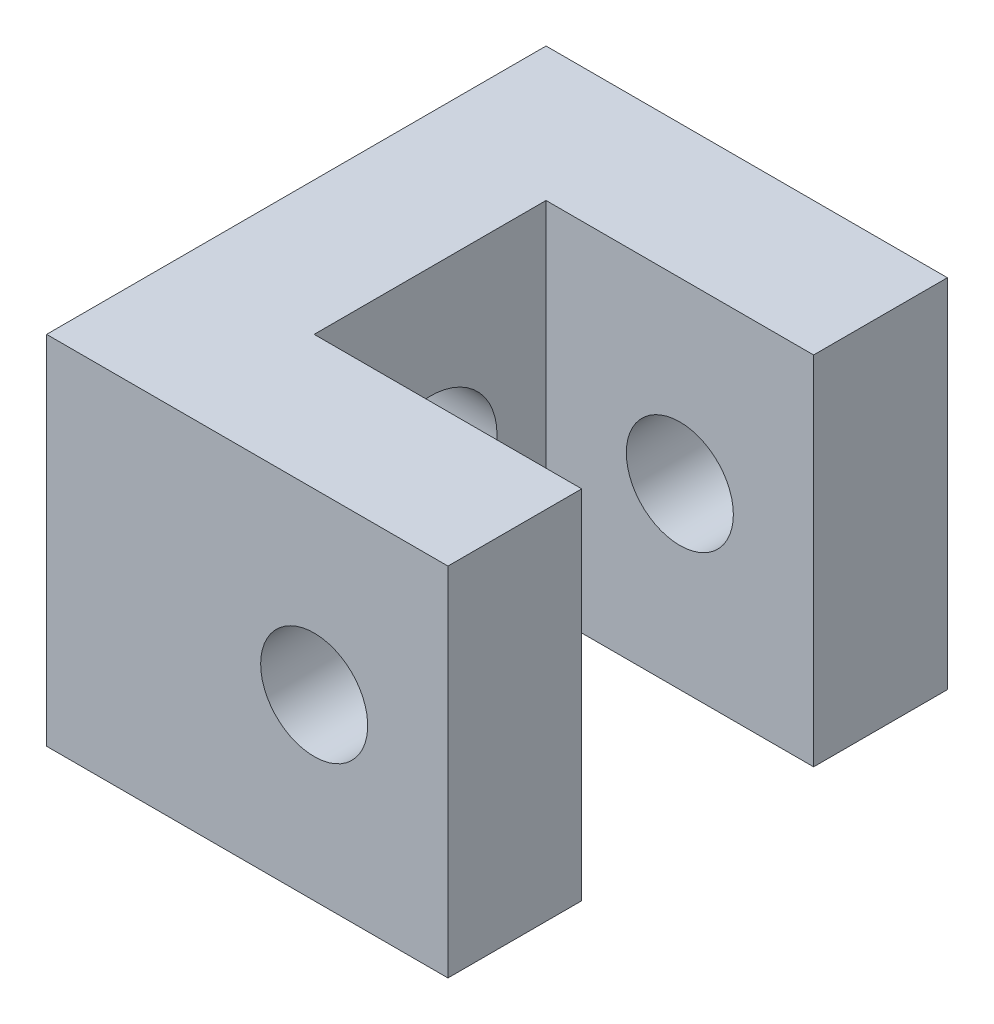
ISO-10303-21;
HEADER;
FILE_DESCRIPTION(('STEP AP214'),'2;1');
FILE_NAME('part.step','',(''),(''),'','','');
FILE_SCHEMA(('AUTOMOTIVE_DESIGN { 1 0 10303 214 1 1 1 1 }'));
ENDSEC;
DATA;
#1=APPLICATION_CONTEXT('core data for automotive mechanical design processes');
#2=APPLICATION_PROTOCOL_DEFINITION('international standard','automotive_design',2000,#1);
#3=PRODUCT_CONTEXT('',#1,'mechanical');
#4=PRODUCT('Part','Part','',(#3));
#5=PRODUCT_RELATED_PRODUCT_CATEGORY('part','',(#4));
#6=PRODUCT_DEFINITION_FORMATION('','',#4);
#7=PRODUCT_DEFINITION_CONTEXT('part definition',#1,'design');
#8=PRODUCT_DEFINITION('design','',#6,#7);
#9=PRODUCT_DEFINITION_SHAPE('','',#8);
#10=(LENGTH_UNIT() NAMED_UNIT(*) SI_UNIT(.MILLI.,.METRE.));
#11=(NAMED_UNIT(*) PLANE_ANGLE_UNIT() SI_UNIT($,.RADIAN.));
#12=(NAMED_UNIT(*) SI_UNIT($,.STERADIAN.) SOLID_ANGLE_UNIT());
#13=UNCERTAINTY_MEASURE_WITH_UNIT(LENGTH_MEASURE(1.E-05),#10,'distance_accuracy_value','');
#14=(GEOMETRIC_REPRESENTATION_CONTEXT(3) GLOBAL_UNCERTAINTY_ASSIGNED_CONTEXT((#13)) GLOBAL_UNIT_ASSIGNED_CONTEXT((#10,
#11,#12)) REPRESENTATION_CONTEXT('',''));
#15=CARTESIAN_POINT('',(0.,0.,0.));
#16=DIRECTION('',(0.,0.,1.));
#17=DIRECTION('',(1.,0.,0.));
#18=AXIS2_PLACEMENT_3D('',#15,#16,#17);
#19=CARTESIAN_POINT('',(-15.,-20.,0.));
#20=DIRECTION('',(0.,-1.,0.));
#21=DIRECTION('',(0.,0.,-1.));
#22=AXIS2_PLACEMENT_3D('',#19,#20,#21);
#23=PLANE('',#22);
#24=DIRECTION('',(0.,0.,-1.));
#25=VECTOR('',#24,1.);
#26=CARTESIAN_POINT('',(0.,-20.,0.));
#27=LINE('',#26,#25);
#28=CARTESIAN_POINT('',(0.,-20.,13.));
#29=VERTEX_POINT('',#28);
#30=CARTESIAN_POINT('',(0.,-20.,-13.));
#31=VERTEX_POINT('',#30);
#32=EDGE_CURVE('E158',#29,#31,#27,.T.);
#33=ORIENTED_EDGE('',*,*,#32,.F.);
#34=DIRECTION('',(-1.,0.,0.));
#35=VECTOR('',#34,1.);
#36=CARTESIAN_POINT('',(30.,-20.,13.));
#37=LINE('',#36,#35);
#38=CARTESIAN_POINT('',(30.,-20.,13.));
#39=VERTEX_POINT('',#38);
#40=EDGE_CURVE('E156',#39,#29,#37,.T.);
#41=ORIENTED_EDGE('',*,*,#40,.F.);
#42=DIRECTION('',(0.,0.,-1.));
#43=VECTOR('',#42,1.);
#44=CARTESIAN_POINT('',(30.,-20.,0.));
#45=LINE('',#44,#43);
#46=CARTESIAN_POINT('',(30.,-20.,28.));
#47=VERTEX_POINT('',#46);
#48=EDGE_CURVE('E135',#47,#39,#45,.T.);
#49=ORIENTED_EDGE('',*,*,#48,.F.);
#50=DIRECTION('',(1.,0.,0.));
#51=VECTOR('',#50,1.);
#52=CARTESIAN_POINT('',(-15.,-20.,28.));
#53=LINE('',#52,#51);
#54=CARTESIAN_POINT('',(-15.,-20.,28.));
#55=VERTEX_POINT('',#54);
#56=EDGE_CURVE('E11',#55,#47,#53,.T.);
#57=ORIENTED_EDGE('',*,*,#56,.F.);
#58=DIRECTION('',(0.,0.,-1.));
#59=VECTOR('',#58,1.);
#60=CARTESIAN_POINT('',(-15.,-20.,0.));
#61=LINE('',#60,#59);
#62=CARTESIAN_POINT('',(-15.,-20.,-28.));
#63=VERTEX_POINT('',#62);
#64=EDGE_CURVE('E149',#55,#63,#61,.T.);
#65=ORIENTED_EDGE('',*,*,#64,.T.);
#66=DIRECTION('',(1.,0.,0.));
#67=VECTOR('',#66,1.);
#68=CARTESIAN_POINT('',(-15.,-20.,-28.));
#69=LINE('',#68,#67);
#70=CARTESIAN_POINT('',(30.,-20.,-28.));
#71=VERTEX_POINT('',#70);
#72=EDGE_CURVE('E117',#63,#71,#69,.T.);
#73=ORIENTED_EDGE('',*,*,#72,.T.);
#74=DIRECTION('',(0.,0.,-1.));
#75=VECTOR('',#74,1.);
#76=CARTESIAN_POINT('',(30.,-20.,0.));
#77=LINE('',#76,#75);
#78=CARTESIAN_POINT('',(30.,-20.,-13.));
#79=VERTEX_POINT('',#78);
#80=EDGE_CURVE('E116',#79,#71,#77,.T.);
#81=ORIENTED_EDGE('',*,*,#80,.F.);
#82=DIRECTION('',(-1.,0.,0.));
#83=VECTOR('',#82,1.);
#84=CARTESIAN_POINT('',(30.,-20.,-13.));
#85=LINE('',#84,#83);
#86=EDGE_CURVE('E105',#79,#31,#85,.T.);
#87=ORIENTED_EDGE('',*,*,#86,.T.);
#88=EDGE_LOOP('',(#33,#41,#49,#57,#65,#73,#81,#87));
#89=FACE_BOUND('',#88,.T.);
#90=ADVANCED_FACE('F39',(#89),#23,.T.);
#91=CARTESIAN_POINT('',(-15.,0.,28.));
#92=DIRECTION('',(0.,0.,-1.));
#93=DIRECTION('',(-1.,0.,0.));
#94=AXIS2_PLACEMENT_3D('',#91,#92,#93);
#95=PLANE('',#94);
#96=CARTESIAN_POINT('',(15.,0.,28.));
#97=DIRECTION('',(0.,0.,-1.));
#98=DIRECTION('',(-1.,0.,0.));
#99=AXIS2_PLACEMENT_3D('',#96,#97,#98);
#100=CIRCLE('',#99,6.);
#101=CARTESIAN_POINT('',(8.99999999999999,0.,28.));
#102=VERTEX_POINT('',#101);
#103=EDGE_CURVE('E255',#102,#102,#100,.T.);
#104=ORIENTED_EDGE('',*,*,#103,.T.);
#105=EDGE_LOOP('',(#104));
#106=FACE_BOUND('',#105,.T.);
#107=ORIENTED_EDGE('',*,*,#56,.T.);
#108=DIRECTION('',(0.,1.,0.));
#109=VECTOR('',#108,1.);
#110=CARTESIAN_POINT('',(30.,0.,28.));
#111=LINE('',#110,#109);
#112=CARTESIAN_POINT('',(30.,20.,28.));
#113=VERTEX_POINT('',#112);
#114=EDGE_CURVE('E143',#47,#113,#111,.T.);
#115=ORIENTED_EDGE('',*,*,#114,.T.);
#116=DIRECTION('',(1.,0.,0.));
#117=VECTOR('',#116,1.);
#118=CARTESIAN_POINT('',(-15.,20.,28.));
#119=LINE('',#118,#117);
#120=CARTESIAN_POINT('',(-15.,20.,28.));
#121=VERTEX_POINT('',#120);
#122=EDGE_CURVE('E47',#121,#113,#119,.T.);
#123=ORIENTED_EDGE('',*,*,#122,.F.);
#124=DIRECTION('',(0.,1.,0.));
#125=VECTOR('',#124,1.);
#126=CARTESIAN_POINT('',(-15.,0.,28.));
#127=LINE('',#126,#125);
#128=EDGE_CURVE('E183',#55,#121,#127,.T.);
#129=ORIENTED_EDGE('',*,*,#128,.F.);
#130=EDGE_LOOP('',(#107,#115,#123,#129));
#131=FACE_BOUND('',#130,.T.);
#132=ADVANCED_FACE('F210',(#106,#131),#95,.F.);
#133=CARTESIAN_POINT('',(-15.,20.,0.));
#134=DIRECTION('',(0.,-1.,0.));
#135=DIRECTION('',(0.,0.,-1.));
#136=AXIS2_PLACEMENT_3D('',#133,#134,#135);
#137=PLANE('',#136);
#138=ORIENTED_EDGE('',*,*,#122,.T.);
#139=DIRECTION('',(0.,0.,-1.));
#140=VECTOR('',#139,1.);
#141=CARTESIAN_POINT('',(30.,20.,0.));
#142=LINE('',#141,#140);
#143=CARTESIAN_POINT('',(30.,20.,13.));
#144=VERTEX_POINT('',#143);
#145=EDGE_CURVE('E140',#113,#144,#142,.T.);
#146=ORIENTED_EDGE('',*,*,#145,.T.);
#147=DIRECTION('',(-1.,0.,0.));
#148=VECTOR('',#147,1.);
#149=CARTESIAN_POINT('',(30.,20.,13.));
#150=LINE('',#149,#148);
#151=CARTESIAN_POINT('',(0.,20.,13.));
#152=VERTEX_POINT('',#151);
#153=EDGE_CURVE('E146',#144,#152,#150,.T.);
#154=ORIENTED_EDGE('',*,*,#153,.T.);
#155=DIRECTION('',(0.,0.,-1.));
#156=VECTOR('',#155,1.);
#157=CARTESIAN_POINT('',(0.,20.,0.));
#158=LINE('',#157,#156);
#159=CARTESIAN_POINT('',(0.,20.,-13.));
#160=VERTEX_POINT('',#159);
#161=EDGE_CURVE('E162',#152,#160,#158,.T.);
#162=ORIENTED_EDGE('',*,*,#161,.T.);
#163=DIRECTION('',(-1.,0.,0.));
#164=VECTOR('',#163,1.);
#165=CARTESIAN_POINT('',(30.,20.,-13.));
#166=LINE('',#165,#164);
#167=CARTESIAN_POINT('',(30.,20.,-13.));
#168=VERTEX_POINT('',#167);
#169=EDGE_CURVE('E113',#168,#160,#166,.T.);
#170=ORIENTED_EDGE('',*,*,#169,.F.);
#171=DIRECTION('',(0.,0.,-1.));
#172=VECTOR('',#171,1.);
#173=CARTESIAN_POINT('',(30.,20.,0.));
#174=LINE('',#173,#172);
#175=CARTESIAN_POINT('',(30.,20.,-28.));
#176=VERTEX_POINT('',#175);
#177=EDGE_CURVE('E125',#168,#176,#174,.T.);
#178=ORIENTED_EDGE('',*,*,#177,.T.);
#179=DIRECTION('',(1.,0.,0.));
#180=VECTOR('',#179,1.);
#181=CARTESIAN_POINT('',(-15.,20.,-28.));
#182=LINE('',#181,#180);
#183=CARTESIAN_POINT('',(-15.,20.,-28.));
#184=VERTEX_POINT('',#183);
#185=EDGE_CURVE('E180',#184,#176,#182,.T.);
#186=ORIENTED_EDGE('',*,*,#185,.F.);
#187=DIRECTION('',(0.,0.,-1.));
#188=VECTOR('',#187,1.);
#189=CARTESIAN_POINT('',(-15.,20.,0.));
#190=LINE('',#189,#188);
#191=EDGE_CURVE('E186',#121,#184,#190,.T.);
#192=ORIENTED_EDGE('',*,*,#191,.F.);
#193=EDGE_LOOP('',(#138,#146,#154,#162,#170,#178,#186,#192));
#194=FACE_BOUND('',#193,.T.);
#195=ADVANCED_FACE('F199',(#194),#137,.F.);
#196=CARTESIAN_POINT('',(-15.,0.,-28.));
#197=DIRECTION('',(0.,0.,-1.));
#198=DIRECTION('',(-1.,0.,0.));
#199=AXIS2_PLACEMENT_3D('',#196,#197,#198);
#200=PLANE('',#199);
#201=CARTESIAN_POINT('',(15.,0.,-28.));
#202=DIRECTION('',(0.,0.,-1.));
#203=DIRECTION('',(-1.,0.,0.));
#204=AXIS2_PLACEMENT_3D('',#201,#202,#203);
#205=CIRCLE('',#204,6.);
#206=CARTESIAN_POINT('',(8.99999999999999,0.,-28.));
#207=VERTEX_POINT('',#206);
#208=EDGE_CURVE('E254',#207,#207,#205,.T.);
#209=ORIENTED_EDGE('',*,*,#208,.F.);
#210=EDGE_LOOP('',(#209));
#211=FACE_BOUND('',#210,.T.);
#212=ORIENTED_EDGE('',*,*,#185,.T.);
#213=DIRECTION('',(0.,1.,0.));
#214=VECTOR('',#213,1.);
#215=CARTESIAN_POINT('',(30.,0.,-28.));
#216=LINE('',#215,#214);
#217=EDGE_CURVE('E121',#71,#176,#216,.T.);
#218=ORIENTED_EDGE('',*,*,#217,.F.);
#219=ORIENTED_EDGE('',*,*,#72,.F.);
#220=DIRECTION('',(0.,1.,0.));
#221=VECTOR('',#220,1.);
#222=CARTESIAN_POINT('',(-15.,0.,-28.));
#223=LINE('',#222,#221);
#224=EDGE_CURVE('E189',#63,#184,#223,.T.);
#225=ORIENTED_EDGE('',*,*,#224,.T.);
#226=EDGE_LOOP('',(#212,#218,#219,#225));
#227=FACE_BOUND('',#226,.T.);
#228=ADVANCED_FACE('F200',(#211,#227),#200,.T.);
#229=CARTESIAN_POINT('',(-15.,0.,0.));
#230=DIRECTION('',(1.,0.,0.));
#231=DIRECTION('',(0.,0.,-1.));
#232=AXIS2_PLACEMENT_3D('',#229,#230,#231);
#233=CYLINDRICAL_SURFACE('',#232,7.5);
#234=CARTESIAN_POINT('',(-15.,0.,0.));
#235=DIRECTION('',(1.,0.,0.));
#236=DIRECTION('',(0.,0.,-1.));
#237=AXIS2_PLACEMENT_3D('',#234,#235,#236);
#238=CIRCLE('',#237,7.5);
#239=CARTESIAN_POINT('',(-15.,0.,-7.5));
#240=VERTEX_POINT('',#239);
#241=EDGE_CURVE('E181',#240,#240,#238,.T.);
#242=ORIENTED_EDGE('',*,*,#241,.F.);
#243=EDGE_LOOP('',(#242));
#244=FACE_BOUND('',#243,.T.);
#245=CARTESIAN_POINT('',(0.,0.,0.));
#246=DIRECTION('',(1.,0.,0.));
#247=DIRECTION('',(0.,0.,-1.));
#248=AXIS2_PLACEMENT_3D('',#245,#246,#247);
#249=CIRCLE('',#248,7.5);
#250=CARTESIAN_POINT('',(0.,0.,-7.5));
#251=VERTEX_POINT('',#250);
#252=EDGE_CURVE('E170',#251,#251,#249,.T.);
#253=ORIENTED_EDGE('',*,*,#252,.T.);
#254=EDGE_LOOP('',(#253));
#255=FACE_BOUND('',#254,.T.);
#256=ADVANCED_FACE('F202',(#244,#255),#233,.F.);
#257=CARTESIAN_POINT('',(-15.,0.,0.));
#258=DIRECTION('',(1.,0.,0.));
#259=DIRECTION('',(0.,0.,-1.));
#260=AXIS2_PLACEMENT_3D('',#257,#258,#259);
#261=PLANE('',#260);
#262=ORIENTED_EDGE('',*,*,#64,.F.);
#263=ORIENTED_EDGE('',*,*,#128,.T.);
#264=ORIENTED_EDGE('',*,*,#191,.T.);
#265=ORIENTED_EDGE('',*,*,#224,.F.);
#266=EDGE_LOOP('',(#262,#263,#264,#265));
#267=FACE_BOUND('',#266,.T.);
#268=ORIENTED_EDGE('',*,*,#241,.T.);
#269=EDGE_LOOP('',(#268));
#270=FACE_BOUND('',#269,.T.);
#271=ADVANCED_FACE('F195',(#267,#270),#261,.F.);
#272=CARTESIAN_POINT('',(0.,0.,0.));
#273=DIRECTION('',(1.,0.,0.));
#274=DIRECTION('',(0.,0.,-1.));
#275=AXIS2_PLACEMENT_3D('',#272,#273,#274);
#276=PLANE('',#275);
#277=DIRECTION('',(0.,1.,0.));
#278=VECTOR('',#277,1.);
#279=CARTESIAN_POINT('',(0.,0.,-13.));
#280=LINE('',#279,#278);
#281=EDGE_CURVE('E112',#31,#160,#280,.T.);
#282=ORIENTED_EDGE('',*,*,#281,.T.);
#283=ORIENTED_EDGE('',*,*,#161,.F.);
#284=DIRECTION('',(0.,1.,0.));
#285=VECTOR('',#284,1.);
#286=CARTESIAN_POINT('',(0.,0.,13.));
#287=LINE('',#286,#285);
#288=EDGE_CURVE('E55',#29,#152,#287,.T.);
#289=ORIENTED_EDGE('',*,*,#288,.F.);
#290=ORIENTED_EDGE('',*,*,#32,.T.);
#291=EDGE_LOOP('',(#282,#283,#289,#290));
#292=FACE_BOUND('',#291,.T.);
#293=ORIENTED_EDGE('',*,*,#252,.F.);
#294=EDGE_LOOP('',(#293));
#295=FACE_BOUND('',#294,.T.);
#296=ADVANCED_FACE('F224',(#292,#295),#276,.T.);
#297=CARTESIAN_POINT('',(30.,0.,13.));
#298=DIRECTION('',(0.,0.,1.));
#299=DIRECTION('',(1.,0.,0.));
#300=AXIS2_PLACEMENT_3D('',#297,#298,#299);
#301=PLANE('',#300);
#302=CARTESIAN_POINT('',(15.,0.,13.));
#303=DIRECTION('',(0.,0.,1.));
#304=DIRECTION('',(1.,0.,0.));
#305=AXIS2_PLACEMENT_3D('',#302,#303,#304);
#306=CIRCLE('',#305,6.);
#307=CARTESIAN_POINT('',(21.,0.,13.));
#308=VERTEX_POINT('',#307);
#309=EDGE_CURVE('E127',#308,#308,#306,.T.);
#310=ORIENTED_EDGE('',*,*,#309,.T.);
#311=EDGE_LOOP('',(#310));
#312=FACE_BOUND('',#311,.T.);
#313=ORIENTED_EDGE('',*,*,#288,.T.);
#314=ORIENTED_EDGE('',*,*,#153,.F.);
#315=DIRECTION('',(0.,1.,0.));
#316=VECTOR('',#315,1.);
#317=CARTESIAN_POINT('',(30.,0.,13.));
#318=LINE('',#317,#316);
#319=EDGE_CURVE('E138',#39,#144,#318,.T.);
#320=ORIENTED_EDGE('',*,*,#319,.F.);
#321=ORIENTED_EDGE('',*,*,#40,.T.);
#322=EDGE_LOOP('',(#313,#314,#320,#321));
#323=FACE_BOUND('',#322,.T.);
#324=ADVANCED_FACE('F227',(#312,#323),#301,.F.);
#325=CARTESIAN_POINT('',(30.,0.,0.));
#326=DIRECTION('',(1.,0.,0.));
#327=DIRECTION('',(0.,0.,-1.));
#328=AXIS2_PLACEMENT_3D('',#325,#326,#327);
#329=PLANE('',#328);
#330=ORIENTED_EDGE('',*,*,#48,.T.);
#331=ORIENTED_EDGE('',*,*,#319,.T.);
#332=ORIENTED_EDGE('',*,*,#145,.F.);
#333=ORIENTED_EDGE('',*,*,#114,.F.);
#334=EDGE_LOOP('',(#330,#331,#332,#333));
#335=FACE_BOUND('',#334,.T.);
#336=ADVANCED_FACE('F232',(#335),#329,.T.);
#337=CARTESIAN_POINT('',(30.,0.,-13.));
#338=DIRECTION('',(0.,0.,1.));
#339=DIRECTION('',(1.,0.,0.));
#340=AXIS2_PLACEMENT_3D('',#337,#338,#339);
#341=PLANE('',#340);
#342=CARTESIAN_POINT('',(15.,0.,-13.));
#343=DIRECTION('',(0.,0.,1.));
#344=DIRECTION('',(1.,0.,0.));
#345=AXIS2_PLACEMENT_3D('',#342,#343,#344);
#346=CIRCLE('',#345,6.);
#347=CARTESIAN_POINT('',(21.,0.,-13.));
#348=VERTEX_POINT('',#347);
#349=EDGE_CURVE('E42',#348,#348,#346,.T.);
#350=ORIENTED_EDGE('',*,*,#349,.F.);
#351=EDGE_LOOP('',(#350));
#352=FACE_BOUND('',#351,.T.);
#353=ORIENTED_EDGE('',*,*,#281,.F.);
#354=ORIENTED_EDGE('',*,*,#86,.F.);
#355=DIRECTION('',(0.,1.,0.));
#356=VECTOR('',#355,1.);
#357=CARTESIAN_POINT('',(30.,0.,-13.));
#358=LINE('',#357,#356);
#359=EDGE_CURVE('E109',#79,#168,#358,.T.);
#360=ORIENTED_EDGE('',*,*,#359,.T.);
#361=ORIENTED_EDGE('',*,*,#169,.T.);
#362=EDGE_LOOP('',(#353,#354,#360,#361));
#363=FACE_BOUND('',#362,.T.);
#364=ADVANCED_FACE('F107',(#352,#363),#341,.T.);
#365=CARTESIAN_POINT('',(30.,0.,0.));
#366=DIRECTION('',(1.,0.,0.));
#367=DIRECTION('',(0.,0.,-1.));
#368=AXIS2_PLACEMENT_3D('',#365,#366,#367);
#369=PLANE('',#368);
#370=ORIENTED_EDGE('',*,*,#359,.F.);
#371=ORIENTED_EDGE('',*,*,#80,.T.);
#372=ORIENTED_EDGE('',*,*,#217,.T.);
#373=ORIENTED_EDGE('',*,*,#177,.F.);
#374=EDGE_LOOP('',(#370,#371,#372,#373));
#375=FACE_BOUND('',#374,.T.);
#376=ADVANCED_FACE('F123',(#375),#369,.T.);
#377=CARTESIAN_POINT('',(15.,0.,28.));
#378=DIRECTION('',(0.,0.,-1.));
#379=DIRECTION('',(-1.,0.,0.));
#380=AXIS2_PLACEMENT_3D('',#377,#378,#379);
#381=CYLINDRICAL_SURFACE('',#380,6.);
#382=ORIENTED_EDGE('',*,*,#349,.T.);
#383=EDGE_LOOP('',(#382));
#384=FACE_BOUND('',#383,.T.);
#385=ORIENTED_EDGE('',*,*,#208,.T.);
#386=EDGE_LOOP('',(#385));
#387=FACE_BOUND('',#386,.T.);
#388=ADVANCED_FACE('F242',(#384,#387),#381,.F.);
#389=ORIENTED_EDGE('',*,*,#103,.F.);
#390=EDGE_LOOP('',(#389));
#391=FACE_BOUND('',#390,.T.);
#392=ORIENTED_EDGE('',*,*,#309,.F.);
#393=EDGE_LOOP('',(#392));
#394=FACE_BOUND('',#393,.T.);
#395=ADVANCED_FACE('F244',(#391,#394),#381,.F.);
#396=CLOSED_SHELL('',(#90,#132,#195,#228,#256,#271,#296,#324,#336,#364,#376,#388,#395));
#397=MANIFOLD_SOLID_BREP('B2',#396);
#398=ADVANCED_BREP_SHAPE_REPRESENTATION('',(#18,#397),#14);
#399=SHAPE_DEFINITION_REPRESENTATION(#9,#398);
ENDSEC;
END-ISO-10303-21;
